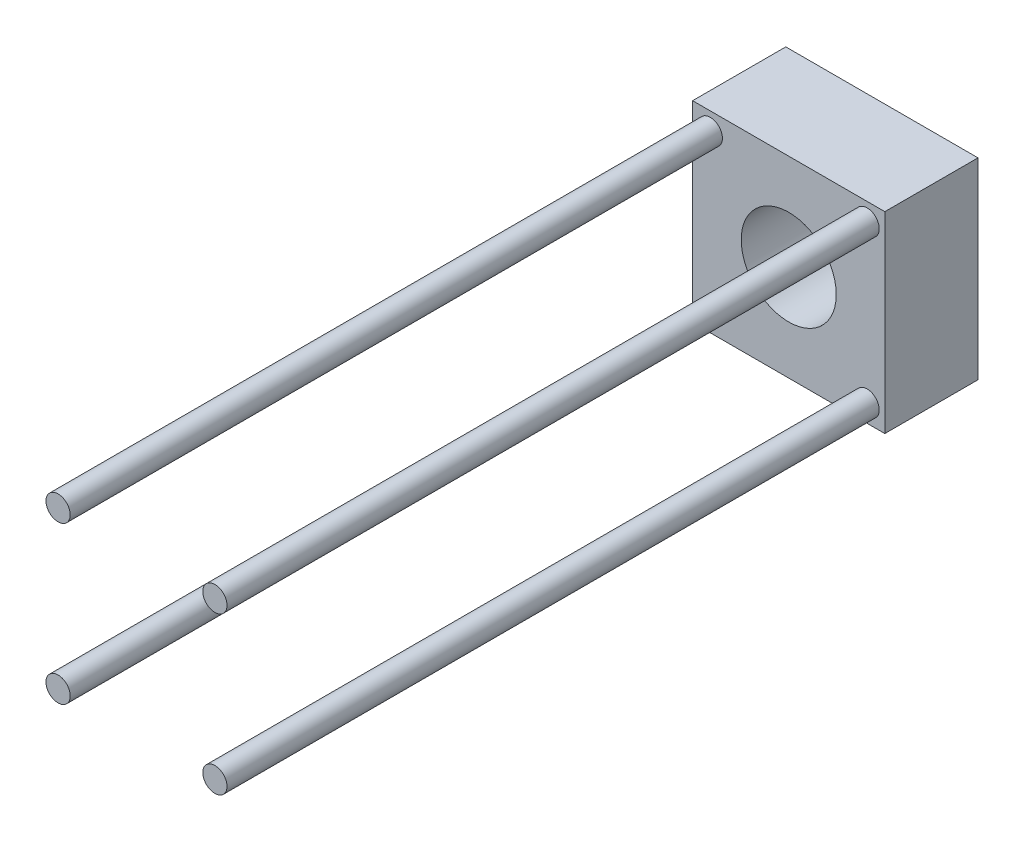
ISO-10303-21;
HEADER;
FILE_DESCRIPTION(('STEP AP214'),'2;1');
FILE_NAME('part.step','',(''),(''),'','','');
FILE_SCHEMA(('AUTOMOTIVE_DESIGN { 1 0 10303 214 1 1 1 1 }'));
ENDSEC;
DATA;
#1=APPLICATION_CONTEXT('core data for automotive mechanical design processes');
#2=APPLICATION_PROTOCOL_DEFINITION('international standard','automotive_design',2000,#1);
#3=PRODUCT_CONTEXT('',#1,'mechanical');
#4=PRODUCT('Part','Part','',(#3));
#5=PRODUCT_RELATED_PRODUCT_CATEGORY('part','',(#4));
#6=PRODUCT_DEFINITION_FORMATION('','',#4);
#7=PRODUCT_DEFINITION_CONTEXT('part definition',#1,'design');
#8=PRODUCT_DEFINITION('design','',#6,#7);
#9=PRODUCT_DEFINITION_SHAPE('','',#8);
#10=(LENGTH_UNIT() NAMED_UNIT(*) SI_UNIT(.MILLI.,.METRE.));
#11=(NAMED_UNIT(*) PLANE_ANGLE_UNIT() SI_UNIT($,.RADIAN.));
#12=(NAMED_UNIT(*) SI_UNIT($,.STERADIAN.) SOLID_ANGLE_UNIT());
#13=UNCERTAINTY_MEASURE_WITH_UNIT(LENGTH_MEASURE(1.E-05),#10,'distance_accuracy_value','');
#14=(GEOMETRIC_REPRESENTATION_CONTEXT(3) GLOBAL_UNCERTAINTY_ASSIGNED_CONTEXT((#13)) GLOBAL_UNIT_ASSIGNED_CONTEXT((#10,
#11,#12)) REPRESENTATION_CONTEXT('',''));
#15=CARTESIAN_POINT('',(0.,0.,0.));
#16=DIRECTION('',(0.,0.,1.));
#17=DIRECTION('',(1.,0.,0.));
#18=AXIS2_PLACEMENT_3D('',#15,#16,#17);
#19=CARTESIAN_POINT('',(-5.15728534804794,-291545.,-15.));
#20=DIRECTION('',(1.,0.,0.));
#21=DIRECTION('',(0.,1.,0.));
#22=AXIS2_PLACEMENT_3D('',#19,#20,#21);
#23=PLANE('',#22);
#24=DIRECTION('',(0.,-1.,0.));
#25=VECTOR('',#24,1.);
#26=CARTESIAN_POINT('',(-5.15728534804794,-291545.,-20.));
#27=LINE('',#26,#25);
#28=CARTESIAN_POINT('',(-5.15728534804794,5.15728534802473,-20.));
#29=VERTEX_POINT('',#28);
#30=CARTESIAN_POINT('',(-5.15728534804794,-5.15728534803751,-20.));
#31=VERTEX_POINT('',#30);
#32=EDGE_CURVE('E98',#29,#31,#27,.T.);
#33=ORIENTED_EDGE('',*,*,#32,.T.);
#34=DIRECTION('',(0.,0.,-1.));
#35=VECTOR('',#34,1.);
#36=CARTESIAN_POINT('',(-5.15728534804794,-5.15728534803751,-15.));
#37=LINE('',#36,#35);
#38=CARTESIAN_POINT('',(-5.15728534804794,-5.15728534803751,-15.));
#39=VERTEX_POINT('',#38);
#40=EDGE_CURVE('E11',#39,#31,#37,.T.);
#41=ORIENTED_EDGE('',*,*,#40,.F.);
#42=DIRECTION('',(0.,-1.,0.));
#43=VECTOR('',#42,1.);
#44=CARTESIAN_POINT('',(-5.15728534804794,-291545.,-15.));
#45=LINE('',#44,#43);
#46=CARTESIAN_POINT('',(-5.15728534804794,5.15728534802473,-15.));
#47=VERTEX_POINT('',#46);
#48=EDGE_CURVE('E86',#47,#39,#45,.T.);
#49=ORIENTED_EDGE('',*,*,#48,.F.);
#50=DIRECTION('',(0.,0.,-1.));
#51=VECTOR('',#50,1.);
#52=CARTESIAN_POINT('',(-5.15728534804794,5.15728534802473,-15.));
#53=LINE('',#52,#51);
#54=EDGE_CURVE('E94',#47,#29,#53,.T.);
#55=ORIENTED_EDGE('',*,*,#54,.T.);
#56=EDGE_LOOP('',(#33,#41,#49,#55));
#57=FACE_BOUND('',#56,.T.);
#58=ADVANCED_FACE('F35',(#57),#23,.F.);
#59=CARTESIAN_POINT('',(-400000.,-5.15728534810478,-15.));
#60=DIRECTION('',(0.,1.,0.));
#61=DIRECTION('',(-1.,0.,0.));
#62=AXIS2_PLACEMENT_3D('',#59,#60,#61);
#63=PLANE('',#62);
#64=DIRECTION('',(1.,0.,0.));
#65=VECTOR('',#64,1.);
#66=CARTESIAN_POINT('',(-400000.,-5.15728534810478,-20.));
#67=LINE('',#66,#65);
#68=CARTESIAN_POINT('',(5.15728534802342,-5.15728534804794,-20.));
#69=VERTEX_POINT('',#68);
#70=EDGE_CURVE('E90',#31,#69,#67,.T.);
#71=ORIENTED_EDGE('',*,*,#70,.T.);
#72=DIRECTION('',(0.,0.,-1.));
#73=VECTOR('',#72,1.);
#74=CARTESIAN_POINT('',(5.15728534802342,-5.15728534804794,-15.));
#75=LINE('',#74,#73);
#76=CARTESIAN_POINT('',(5.15728534802342,-5.15728534804794,-15.));
#77=VERTEX_POINT('',#76);
#78=EDGE_CURVE('E43',#77,#69,#75,.T.);
#79=ORIENTED_EDGE('',*,*,#78,.F.);
#80=DIRECTION('',(1.,0.,0.));
#81=VECTOR('',#80,1.);
#82=CARTESIAN_POINT('',(-400000.,-5.15728534810478,-15.));
#83=LINE('',#82,#81);
#84=EDGE_CURVE('E81',#39,#77,#83,.T.);
#85=ORIENTED_EDGE('',*,*,#84,.F.);
#86=ORIENTED_EDGE('',*,*,#40,.T.);
#87=EDGE_LOOP('',(#71,#79,#85,#86));
#88=FACE_BOUND('',#87,.T.);
#89=ADVANCED_FACE('F89',(#88),#63,.F.);
#90=CARTESIAN_POINT('',(5.15728534804794,-291545.,-15.));
#91=DIRECTION('',(-1.,0.,0.));
#92=DIRECTION('',(0.,-1.,0.));
#93=AXIS2_PLACEMENT_3D('',#90,#91,#92);
#94=PLANE('',#93);
#95=DIRECTION('',(0.,1.,0.));
#96=VECTOR('',#95,1.);
#97=CARTESIAN_POINT('',(5.15728534804794,-291545.,-20.));
#98=LINE('',#97,#96);
#99=CARTESIAN_POINT('',(5.15728534804794,5.15728534802473,-20.));
#100=VERTEX_POINT('',#99);
#101=EDGE_CURVE('E68',#69,#100,#98,.T.);
#102=ORIENTED_EDGE('',*,*,#101,.T.);
#103=DIRECTION('',(0.,0.,-1.));
#104=VECTOR('',#103,1.);
#105=CARTESIAN_POINT('',(5.15728534804794,5.15728534802473,-15.));
#106=LINE('',#105,#104);
#107=CARTESIAN_POINT('',(5.15728534804794,5.15728534802473,-15.));
#108=VERTEX_POINT('',#107);
#109=EDGE_CURVE('E91',#108,#100,#106,.T.);
#110=ORIENTED_EDGE('',*,*,#109,.F.);
#111=DIRECTION('',(0.,1.,0.));
#112=VECTOR('',#111,1.);
#113=CARTESIAN_POINT('',(5.15728534804794,-291545.,-15.));
#114=LINE('',#113,#112);
#115=EDGE_CURVE('E84',#77,#108,#114,.T.);
#116=ORIENTED_EDGE('',*,*,#115,.F.);
#117=ORIENTED_EDGE('',*,*,#78,.T.);
#118=EDGE_LOOP('',(#102,#110,#116,#117));
#119=FACE_BOUND('',#118,.T.);
#120=ADVANCED_FACE('F92',(#119),#94,.F.);
#121=CARTESIAN_POINT('',(-400000.,5.15728534799109,-15.));
#122=DIRECTION('',(0.,-1.,0.));
#123=DIRECTION('',(1.,0.,0.));
#124=AXIS2_PLACEMENT_3D('',#121,#122,#123);
#125=PLANE('',#124);
#126=DIRECTION('',(-1.,0.,0.));
#127=VECTOR('',#126,1.);
#128=CARTESIAN_POINT('',(-400000.,5.15728534799109,-20.));
#129=LINE('',#128,#127);
#130=EDGE_CURVE('E74',#100,#29,#129,.T.);
#131=ORIENTED_EDGE('',*,*,#130,.T.);
#132=ORIENTED_EDGE('',*,*,#54,.F.);
#133=DIRECTION('',(-1.,0.,0.));
#134=VECTOR('',#133,1.);
#135=CARTESIAN_POINT('',(-400000.,5.15728534799109,-15.));
#136=LINE('',#135,#134);
#137=EDGE_CURVE('E51',#108,#47,#136,.T.);
#138=ORIENTED_EDGE('',*,*,#137,.F.);
#139=ORIENTED_EDGE('',*,*,#109,.T.);
#140=EDGE_LOOP('',(#131,#132,#138,#139));
#141=FACE_BOUND('',#140,.T.);
#142=ADVANCED_FACE('F106',(#141),#125,.F.);
#143=CARTESIAN_POINT('',(0.,0.,-15.));
#144=DIRECTION('',(0.,0.,1.));
#145=DIRECTION('',(1.,0.,0.));
#146=AXIS2_PLACEMENT_3D('',#143,#144,#145);
#147=PLANE('',#146);
#148=CARTESIAN_POINT('',(4.20728534805996,4.20728534805995,-15.));
#149=DIRECTION('',(0.,0.,1.));
#150=DIRECTION('',(1.,0.,0.));
#151=AXIS2_PLACEMENT_3D('',#148,#149,#150);
#152=CIRCLE('',#151,0.65);
#153=CARTESIAN_POINT('',(4.85728534805996,4.20728534805995,-15.));
#154=VERTEX_POINT('',#153);
#155=EDGE_CURVE('E135',#154,#154,#152,.F.);
#156=ORIENTED_EDGE('',*,*,#155,.T.);
#157=EDGE_LOOP('',(#156));
#158=FACE_BOUND('',#157,.T.);
#159=CARTESIAN_POINT('',(-4.20728534805995,4.20728534805996,-15.));
#160=DIRECTION('',(0.,0.,1.));
#161=DIRECTION('',(1.,0.,0.));
#162=AXIS2_PLACEMENT_3D('',#159,#160,#161);
#163=CIRCLE('',#162,0.65);
#164=CARTESIAN_POINT('',(-3.55728534805995,4.20728534805996,-15.));
#165=VERTEX_POINT('',#164);
#166=EDGE_CURVE('E129',#165,#165,#163,.F.);
#167=ORIENTED_EDGE('',*,*,#166,.T.);
#168=EDGE_LOOP('',(#167));
#169=FACE_BOUND('',#168,.T.);
#170=CARTESIAN_POINT('',(-4.20728534805997,-4.20728534805995,-15.));
#171=DIRECTION('',(0.,0.,1.));
#172=DIRECTION('',(1.,0.,0.));
#173=AXIS2_PLACEMENT_3D('',#170,#171,#172);
#174=CIRCLE('',#173,0.65);
#175=CARTESIAN_POINT('',(-3.55728534805997,-4.20728534805995,-15.));
#176=VERTEX_POINT('',#175);
#177=EDGE_CURVE('E123',#176,#176,#174,.F.);
#178=ORIENTED_EDGE('',*,*,#177,.T.);
#179=EDGE_LOOP('',(#178));
#180=FACE_BOUND('',#179,.T.);
#181=CARTESIAN_POINT('',(4.20728534805995,-4.20728534805997,-15.));
#182=DIRECTION('',(0.,0.,1.));
#183=DIRECTION('',(1.,0.,0.));
#184=AXIS2_PLACEMENT_3D('',#181,#182,#183);
#185=CIRCLE('',#184,0.650000000000001);
#186=CARTESIAN_POINT('',(4.85728534805995,-4.20728534805997,-15.));
#187=VERTEX_POINT('',#186);
#188=EDGE_CURVE('E117',#187,#187,#185,.F.);
#189=ORIENTED_EDGE('',*,*,#188,.T.);
#190=EDGE_LOOP('',(#189));
#191=FACE_BOUND('',#190,.T.);
#192=CARTESIAN_POINT('',(0.,0.,-15.));
#193=DIRECTION('',(0.,0.,1.));
#194=DIRECTION('',(1.,0.,0.));
#195=AXIS2_PLACEMENT_3D('',#192,#193,#194);
#196=CIRCLE('',#195,2.55);
#197=CARTESIAN_POINT('',(2.55,0.,-15.));
#198=VERTEX_POINT('',#197);
#199=EDGE_CURVE('E101',#198,#198,#196,.T.);
#200=ORIENTED_EDGE('',*,*,#199,.F.);
#201=EDGE_LOOP('',(#200));
#202=FACE_BOUND('',#201,.T.);
#203=ORIENTED_EDGE('',*,*,#48,.T.);
#204=ORIENTED_EDGE('',*,*,#84,.T.);
#205=ORIENTED_EDGE('',*,*,#115,.T.);
#206=ORIENTED_EDGE('',*,*,#137,.T.);
#207=EDGE_LOOP('',(#203,#204,#205,#206));
#208=FACE_BOUND('',#207,.T.);
#209=ADVANCED_FACE('F82',(#158,#169,#180,#191,#202,#208),#147,.T.);
#210=CARTESIAN_POINT('',(0.,0.,-20.));
#211=DIRECTION('',(0.,0.,1.));
#212=DIRECTION('',(1.,0.,0.));
#213=AXIS2_PLACEMENT_3D('',#210,#211,#212);
#214=PLANE('',#213);
#215=CARTESIAN_POINT('',(0.,0.,-20.));
#216=DIRECTION('',(0.,0.,1.));
#217=DIRECTION('',(1.,0.,0.));
#218=AXIS2_PLACEMENT_3D('',#215,#216,#217);
#219=CIRCLE('',#218,2.55);
#220=CARTESIAN_POINT('',(2.55,0.,-20.));
#221=VERTEX_POINT('',#220);
#222=EDGE_CURVE('E114',#221,#221,#219,.T.);
#223=ORIENTED_EDGE('',*,*,#222,.T.);
#224=EDGE_LOOP('',(#223));
#225=FACE_BOUND('',#224,.T.);
#226=ORIENTED_EDGE('',*,*,#32,.F.);
#227=ORIENTED_EDGE('',*,*,#130,.F.);
#228=ORIENTED_EDGE('',*,*,#101,.F.);
#229=ORIENTED_EDGE('',*,*,#70,.F.);
#230=EDGE_LOOP('',(#226,#227,#228,#229));
#231=FACE_BOUND('',#230,.T.);
#232=ADVANCED_FACE('F109',(#225,#231),#214,.F.);
#233=CARTESIAN_POINT('',(0.,0.,-20.));
#234=DIRECTION('',(0.,0.,1.));
#235=DIRECTION('',(1.,0.,0.));
#236=AXIS2_PLACEMENT_3D('',#233,#234,#235);
#237=CYLINDRICAL_SURFACE('',#236,2.55);
#238=ORIENTED_EDGE('',*,*,#199,.T.);
#239=EDGE_LOOP('',(#238));
#240=FACE_BOUND('',#239,.T.);
#241=ORIENTED_EDGE('',*,*,#222,.F.);
#242=EDGE_LOOP('',(#241));
#243=FACE_BOUND('',#242,.T.);
#244=ADVANCED_FACE('F171',(#240,#243),#237,.F.);
#245=CARTESIAN_POINT('',(4.20728534805995,-4.20728534805997,21.838477631085));
#246=DIRECTION('',(0.,0.,-1.));
#247=DIRECTION('',(-1.,0.,0.));
#248=AXIS2_PLACEMENT_3D('',#245,#246,#247);
#249=CYLINDRICAL_SURFACE('',#248,0.650000000000001);
#250=ORIENTED_EDGE('',*,*,#188,.F.);
#251=EDGE_LOOP('',(#250));
#252=FACE_BOUND('',#251,.T.);
#253=CARTESIAN_POINT('',(4.20728534805995,-4.20728534805997,20.));
#254=DIRECTION('',(0.,0.,1.));
#255=DIRECTION('',(1.,0.,0.));
#256=AXIS2_PLACEMENT_3D('',#253,#254,#255);
#257=CIRCLE('',#256,0.650000000000001);
#258=CARTESIAN_POINT('',(4.85728534805995,-4.20728534805997,20.));
#259=VERTEX_POINT('',#258);
#260=EDGE_CURVE('E120',#259,#259,#257,.T.);
#261=ORIENTED_EDGE('',*,*,#260,.F.);
#262=EDGE_LOOP('',(#261));
#263=FACE_BOUND('',#262,.T.);
#264=ADVANCED_FACE('F178',(#252,#263),#249,.T.);
#265=CARTESIAN_POINT('',(0.,0.,20.));
#266=DIRECTION('',(0.,0.,1.));
#267=DIRECTION('',(1.,0.,0.));
#268=AXIS2_PLACEMENT_3D('',#265,#266,#267);
#269=PLANE('',#268);
#270=ORIENTED_EDGE('',*,*,#260,.T.);
#271=EDGE_LOOP('',(#270));
#272=FACE_BOUND('',#271,.T.);
#273=ADVANCED_FACE('F180',(#272),#269,.T.);
#274=CARTESIAN_POINT('',(-4.20728534805997,-4.20728534805995,21.838477631085));
#275=DIRECTION('',(0.,0.,-1.));
#276=DIRECTION('',(-1.,0.,0.));
#277=AXIS2_PLACEMENT_3D('',#274,#275,#276);
#278=CYLINDRICAL_SURFACE('',#277,0.65);
#279=ORIENTED_EDGE('',*,*,#177,.F.);
#280=EDGE_LOOP('',(#279));
#281=FACE_BOUND('',#280,.T.);
#282=CARTESIAN_POINT('',(-4.20728534805997,-4.20728534805995,20.));
#283=DIRECTION('',(0.,0.,1.));
#284=DIRECTION('',(1.,0.,0.));
#285=AXIS2_PLACEMENT_3D('',#282,#283,#284);
#286=CIRCLE('',#285,0.65);
#287=CARTESIAN_POINT('',(-3.55728534805997,-4.20728534805995,20.));
#288=VERTEX_POINT('',#287);
#289=EDGE_CURVE('E126',#288,#288,#286,.T.);
#290=ORIENTED_EDGE('',*,*,#289,.F.);
#291=EDGE_LOOP('',(#290));
#292=FACE_BOUND('',#291,.T.);
#293=ADVANCED_FACE('F183',(#281,#292),#278,.T.);
#294=CARTESIAN_POINT('',(0.,0.,20.));
#295=DIRECTION('',(0.,0.,1.));
#296=DIRECTION('',(1.,0.,0.));
#297=AXIS2_PLACEMENT_3D('',#294,#295,#296);
#298=PLANE('',#297);
#299=ORIENTED_EDGE('',*,*,#289,.T.);
#300=EDGE_LOOP('',(#299));
#301=FACE_BOUND('',#300,.T.);
#302=ADVANCED_FACE('F188',(#301),#298,.T.);
#303=CARTESIAN_POINT('',(-4.20728534805995,4.20728534805996,21.838477631085));
#304=DIRECTION('',(0.,0.,-1.));
#305=DIRECTION('',(-1.,0.,0.));
#306=AXIS2_PLACEMENT_3D('',#303,#304,#305);
#307=CYLINDRICAL_SURFACE('',#306,0.65);
#308=ORIENTED_EDGE('',*,*,#166,.F.);
#309=EDGE_LOOP('',(#308));
#310=FACE_BOUND('',#309,.T.);
#311=CARTESIAN_POINT('',(-4.20728534805995,4.20728534805996,20.));
#312=DIRECTION('',(0.,0.,1.));
#313=DIRECTION('',(1.,0.,0.));
#314=AXIS2_PLACEMENT_3D('',#311,#312,#313);
#315=CIRCLE('',#314,0.65);
#316=CARTESIAN_POINT('',(-3.55728534805995,4.20728534805996,20.));
#317=VERTEX_POINT('',#316);
#318=EDGE_CURVE('E132',#317,#317,#315,.T.);
#319=ORIENTED_EDGE('',*,*,#318,.F.);
#320=EDGE_LOOP('',(#319));
#321=FACE_BOUND('',#320,.T.);
#322=ADVANCED_FACE('F154',(#310,#321),#307,.T.);
#323=CARTESIAN_POINT('',(0.,0.,20.));
#324=DIRECTION('',(0.,0.,1.));
#325=DIRECTION('',(1.,0.,0.));
#326=AXIS2_PLACEMENT_3D('',#323,#324,#325);
#327=PLANE('',#326);
#328=ORIENTED_EDGE('',*,*,#318,.T.);
#329=EDGE_LOOP('',(#328));
#330=FACE_BOUND('',#329,.T.);
#331=ADVANCED_FACE('F146',(#330),#327,.T.);
#332=CARTESIAN_POINT('',(4.20728534805996,4.20728534805995,21.838477631085));
#333=DIRECTION('',(0.,0.,-1.));
#334=DIRECTION('',(-1.,0.,0.));
#335=AXIS2_PLACEMENT_3D('',#332,#333,#334);
#336=CYLINDRICAL_SURFACE('',#335,0.65);
#337=ORIENTED_EDGE('',*,*,#155,.F.);
#338=EDGE_LOOP('',(#337));
#339=FACE_BOUND('',#338,.T.);
#340=CARTESIAN_POINT('',(4.20728534805996,4.20728534805995,20.));
#341=DIRECTION('',(0.,0.,1.));
#342=DIRECTION('',(1.,0.,0.));
#343=AXIS2_PLACEMENT_3D('',#340,#341,#342);
#344=CIRCLE('',#343,0.65);
#345=CARTESIAN_POINT('',(4.85728534805996,4.20728534805995,20.));
#346=VERTEX_POINT('',#345);
#347=EDGE_CURVE('E138',#346,#346,#344,.T.);
#348=ORIENTED_EDGE('',*,*,#347,.F.);
#349=EDGE_LOOP('',(#348));
#350=FACE_BOUND('',#349,.T.);
#351=ADVANCED_FACE('F144',(#339,#350),#336,.T.);
#352=CARTESIAN_POINT('',(0.,0.,20.));
#353=DIRECTION('',(0.,0.,1.));
#354=DIRECTION('',(1.,0.,0.));
#355=AXIS2_PLACEMENT_3D('',#352,#353,#354);
#356=PLANE('',#355);
#357=ORIENTED_EDGE('',*,*,#347,.T.);
#358=EDGE_LOOP('',(#357));
#359=FACE_BOUND('',#358,.T.);
#360=ADVANCED_FACE('F142',(#359),#356,.T.);
#361=CLOSED_SHELL('',(#58,#89,#120,#142,#209,#232,#244,#264,#273,#293,#302,#322,#331,#351,#360));
#362=MANIFOLD_SOLID_BREP('B2',#361);
#363=ADVANCED_BREP_SHAPE_REPRESENTATION('',(#18,#362),#14);
#364=SHAPE_DEFINITION_REPRESENTATION(#9,#363);
ENDSEC;
END-ISO-10303-21;
